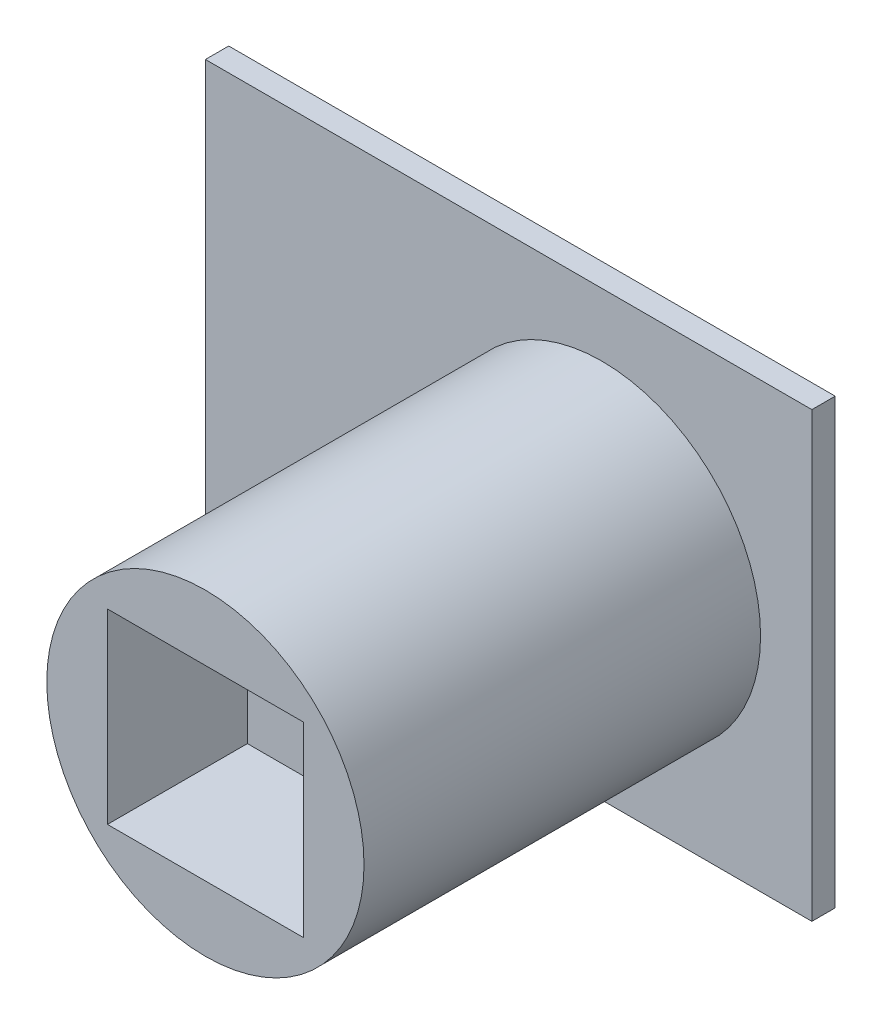
ISO-10303-21;
HEADER;
FILE_DESCRIPTION(('STEP AP214'),'2;1');
FILE_NAME('part.step','',(''),(''),'','','');
FILE_SCHEMA(('AUTOMOTIVE_DESIGN { 1 0 10303 214 1 1 1 1 }'));
ENDSEC;
DATA;
#1=APPLICATION_CONTEXT('core data for automotive mechanical design processes');
#2=APPLICATION_PROTOCOL_DEFINITION('international standard','automotive_design',2000,#1);
#3=PRODUCT_CONTEXT('',#1,'mechanical');
#4=PRODUCT('Part','Part','',(#3));
#5=PRODUCT_RELATED_PRODUCT_CATEGORY('part','',(#4));
#6=PRODUCT_DEFINITION_FORMATION('','',#4);
#7=PRODUCT_DEFINITION_CONTEXT('part definition',#1,'design');
#8=PRODUCT_DEFINITION('design','',#6,#7);
#9=PRODUCT_DEFINITION_SHAPE('','',#8);
#10=(LENGTH_UNIT() NAMED_UNIT(*) SI_UNIT(.MILLI.,.METRE.));
#11=(NAMED_UNIT(*) PLANE_ANGLE_UNIT() SI_UNIT($,.RADIAN.));
#12=(NAMED_UNIT(*) SI_UNIT($,.STERADIAN.) SOLID_ANGLE_UNIT());
#13=UNCERTAINTY_MEASURE_WITH_UNIT(LENGTH_MEASURE(1.E-05),#10,'distance_accuracy_value','');
#14=(GEOMETRIC_REPRESENTATION_CONTEXT(3) GLOBAL_UNCERTAINTY_ASSIGNED_CONTEXT((#13)) GLOBAL_UNIT_ASSIGNED_CONTEXT((#10,
#11,#12)) REPRESENTATION_CONTEXT('',''));
#15=CARTESIAN_POINT('',(0.,0.,0.));
#16=DIRECTION('',(0.,0.,1.));
#17=DIRECTION('',(1.,0.,0.));
#18=AXIS2_PLACEMENT_3D('',#15,#16,#17);
#19=CARTESIAN_POINT('',(65.,-47.5,5.));
#20=DIRECTION('',(-1.,0.,0.));
#21=DIRECTION('',(0.,0.,1.));
#22=AXIS2_PLACEMENT_3D('',#19,#20,#21);
#23=PLANE('',#22);
#24=DIRECTION('',(0.,1.,0.));
#25=VECTOR('',#24,1.);
#26=CARTESIAN_POINT('',(65.,-47.5,0.));
#27=LINE('',#26,#25);
#28=CARTESIAN_POINT('',(65.,-47.5,0.));
#29=VERTEX_POINT('',#28);
#30=CARTESIAN_POINT('',(65.,47.5,0.));
#31=VERTEX_POINT('',#30);
#32=EDGE_CURVE('E172',#29,#31,#27,.T.);
#33=ORIENTED_EDGE('',*,*,#32,.T.);
#34=DIRECTION('',(0.,0.,-1.));
#35=VECTOR('',#34,1.);
#36=CARTESIAN_POINT('',(65.,47.5,5.));
#37=LINE('',#36,#35);
#38=CARTESIAN_POINT('',(65.,47.5,5.));
#39=VERTEX_POINT('',#38);
#40=EDGE_CURVE('E46',#39,#31,#37,.T.);
#41=ORIENTED_EDGE('',*,*,#40,.F.);
#42=DIRECTION('',(0.,1.,0.));
#43=VECTOR('',#42,1.);
#44=CARTESIAN_POINT('',(65.,-47.5,5.));
#45=LINE('',#44,#43);
#46=CARTESIAN_POINT('',(65.,-47.5,5.));
#47=VERTEX_POINT('',#46);
#48=EDGE_CURVE('E174',#47,#39,#45,.T.);
#49=ORIENTED_EDGE('',*,*,#48,.F.);
#50=DIRECTION('',(0.,0.,-1.));
#51=VECTOR('',#50,1.);
#52=CARTESIAN_POINT('',(65.,-47.5,5.));
#53=LINE('',#52,#51);
#54=EDGE_CURVE('E184',#47,#29,#53,.T.);
#55=ORIENTED_EDGE('',*,*,#54,.T.);
#56=EDGE_LOOP('',(#33,#41,#49,#55));
#57=FACE_BOUND('',#56,.T.);
#58=ADVANCED_FACE('F43',(#57),#23,.F.);
#59=CARTESIAN_POINT('',(-65.,47.5,5.));
#60=DIRECTION('',(0.,-1.,0.));
#61=DIRECTION('',(0.,0.,-1.));
#62=AXIS2_PLACEMENT_3D('',#59,#60,#61);
#63=PLANE('',#62);
#64=DIRECTION('',(-1.,0.,0.));
#65=VECTOR('',#64,1.);
#66=CARTESIAN_POINT('',(-65.,47.5,0.));
#67=LINE('',#66,#65);
#68=CARTESIAN_POINT('',(-65.,47.5,0.));
#69=VERTEX_POINT('',#68);
#70=EDGE_CURVE('E188',#31,#69,#67,.T.);
#71=ORIENTED_EDGE('',*,*,#70,.T.);
#72=DIRECTION('',(0.,0.,-1.));
#73=VECTOR('',#72,1.);
#74=CARTESIAN_POINT('',(-65.,47.5,5.));
#75=LINE('',#74,#73);
#76=CARTESIAN_POINT('',(-65.,47.5,5.));
#77=VERTEX_POINT('',#76);
#78=EDGE_CURVE('E200',#77,#69,#75,.T.);
#79=ORIENTED_EDGE('',*,*,#78,.F.);
#80=DIRECTION('',(-1.,0.,0.));
#81=VECTOR('',#80,1.);
#82=CARTESIAN_POINT('',(-65.,47.5,5.));
#83=LINE('',#82,#81);
#84=EDGE_CURVE('E97',#39,#77,#83,.T.);
#85=ORIENTED_EDGE('',*,*,#84,.F.);
#86=ORIENTED_EDGE('',*,*,#40,.T.);
#87=EDGE_LOOP('',(#71,#79,#85,#86));
#88=FACE_BOUND('',#87,.T.);
#89=ADVANCED_FACE('F208',(#88),#63,.F.);
#90=CARTESIAN_POINT('',(-65.,-47.5,5.));
#91=DIRECTION('',(1.,0.,0.));
#92=DIRECTION('',(0.,0.,-1.));
#93=AXIS2_PLACEMENT_3D('',#90,#91,#92);
#94=PLANE('',#93);
#95=DIRECTION('',(0.,-1.,0.));
#96=VECTOR('',#95,1.);
#97=CARTESIAN_POINT('',(-65.,-47.5,0.));
#98=LINE('',#97,#96);
#99=CARTESIAN_POINT('',(-65.,-47.5,0.));
#100=VERTEX_POINT('',#99);
#101=EDGE_CURVE('E191',#69,#100,#98,.T.);
#102=ORIENTED_EDGE('',*,*,#101,.T.);
#103=DIRECTION('',(0.,0.,-1.));
#104=VECTOR('',#103,1.);
#105=CARTESIAN_POINT('',(-65.,-47.5,5.));
#106=LINE('',#105,#104);
#107=CARTESIAN_POINT('',(-65.,-47.5,5.));
#108=VERTEX_POINT('',#107);
#109=EDGE_CURVE('E198',#108,#100,#106,.T.);
#110=ORIENTED_EDGE('',*,*,#109,.F.);
#111=DIRECTION('',(0.,-1.,0.));
#112=VECTOR('',#111,1.);
#113=CARTESIAN_POINT('',(-65.,-47.5,5.));
#114=LINE('',#113,#112);
#115=EDGE_CURVE('E179',#77,#108,#114,.T.);
#116=ORIENTED_EDGE('',*,*,#115,.F.);
#117=ORIENTED_EDGE('',*,*,#78,.T.);
#118=EDGE_LOOP('',(#102,#110,#116,#117));
#119=FACE_BOUND('',#118,.T.);
#120=ADVANCED_FACE('F215',(#119),#94,.F.);
#121=CARTESIAN_POINT('',(-65.,-47.5,5.));
#122=DIRECTION('',(0.,1.,0.));
#123=DIRECTION('',(0.,0.,1.));
#124=AXIS2_PLACEMENT_3D('',#121,#122,#123);
#125=PLANE('',#124);
#126=DIRECTION('',(1.,0.,0.));
#127=VECTOR('',#126,1.);
#128=CARTESIAN_POINT('',(-65.,-47.5,0.));
#129=LINE('',#128,#127);
#130=EDGE_CURVE('E89',#100,#29,#129,.T.);
#131=ORIENTED_EDGE('',*,*,#130,.T.);
#132=ORIENTED_EDGE('',*,*,#54,.F.);
#133=DIRECTION('',(1.,0.,0.));
#134=VECTOR('',#133,1.);
#135=CARTESIAN_POINT('',(-65.,-47.5,5.));
#136=LINE('',#135,#134);
#137=EDGE_CURVE('E68',#108,#47,#136,.T.);
#138=ORIENTED_EDGE('',*,*,#137,.F.);
#139=ORIENTED_EDGE('',*,*,#109,.T.);
#140=EDGE_LOOP('',(#131,#132,#138,#139));
#141=FACE_BOUND('',#140,.T.);
#142=ADVANCED_FACE('F216',(#141),#125,.F.);
#143=CARTESIAN_POINT('',(0.,0.,5.));
#144=DIRECTION('',(0.,0.,-1.));
#145=DIRECTION('',(-1.,0.,0.));
#146=AXIS2_PLACEMENT_3D('',#143,#144,#145);
#147=PLANE('',#146);
#148=CARTESIAN_POINT('',(20.,0.,5.));
#149=DIRECTION('',(0.,0.,1.));
#150=DIRECTION('',(1.,0.,0.));
#151=AXIS2_PLACEMENT_3D('',#148,#149,#150);
#152=CIRCLE('',#151,34.);
#153=CARTESIAN_POINT('',(54.,0.,5.));
#154=VERTEX_POINT('',#153);
#155=EDGE_CURVE('E11',#154,#154,#152,.T.);
#156=ORIENTED_EDGE('',*,*,#155,.F.);
#157=EDGE_LOOP('',(#156));
#158=FACE_BOUND('',#157,.T.);
#159=ORIENTED_EDGE('',*,*,#48,.T.);
#160=ORIENTED_EDGE('',*,*,#84,.T.);
#161=ORIENTED_EDGE('',*,*,#115,.T.);
#162=ORIENTED_EDGE('',*,*,#137,.T.);
#163=EDGE_LOOP('',(#159,#160,#161,#162));
#164=FACE_BOUND('',#163,.T.);
#165=ADVANCED_FACE('F217',(#158,#164),#147,.F.);
#166=CARTESIAN_POINT('',(0.,0.,0.));
#167=DIRECTION('',(0.,0.,-1.));
#168=DIRECTION('',(-1.,0.,0.));
#169=AXIS2_PLACEMENT_3D('',#166,#167,#168);
#170=PLANE('',#169);
#171=ORIENTED_EDGE('',*,*,#32,.F.);
#172=ORIENTED_EDGE('',*,*,#130,.F.);
#173=ORIENTED_EDGE('',*,*,#101,.F.);
#174=ORIENTED_EDGE('',*,*,#70,.F.);
#175=EDGE_LOOP('',(#171,#172,#173,#174));
#176=FACE_BOUND('',#175,.T.);
#177=ADVANCED_FACE('F213',(#176),#170,.T.);
#178=CARTESIAN_POINT('',(20.,0.,90.));
#179=DIRECTION('',(0.,0.,-1.));
#180=DIRECTION('',(-1.,0.,0.));
#181=AXIS2_PLACEMENT_3D('',#178,#179,#180);
#182=CYLINDRICAL_SURFACE('',#181,34.);
#183=CARTESIAN_POINT('',(20.,0.,90.));
#184=DIRECTION('',(0.,0.,1.));
#185=DIRECTION('',(1.,0.,0.));
#186=AXIS2_PLACEMENT_3D('',#183,#184,#185);
#187=CIRCLE('',#186,34.);
#188=CARTESIAN_POINT('',(54.,0.,90.));
#189=VERTEX_POINT('',#188);
#190=EDGE_CURVE('E164',#189,#189,#187,.T.);
#191=ORIENTED_EDGE('',*,*,#190,.F.);
#192=EDGE_LOOP('',(#191));
#193=FACE_BOUND('',#192,.T.);
#194=ORIENTED_EDGE('',*,*,#155,.T.);
#195=EDGE_LOOP('',(#194));
#196=FACE_BOUND('',#195,.T.);
#197=ADVANCED_FACE('F225',(#193,#196),#182,.T.);
#198=CARTESIAN_POINT('',(20.,0.,90.));
#199=DIRECTION('',(0.,0.,1.));
#200=DIRECTION('',(1.,0.,0.));
#201=AXIS2_PLACEMENT_3D('',#198,#199,#200);
#202=PLANE('',#201);
#203=DIRECTION('',(0.,1.,0.));
#204=VECTOR('',#203,1.);
#205=CARTESIAN_POINT('',(41.,-20.,90.));
#206=LINE('',#205,#204);
#207=CARTESIAN_POINT('',(41.,-20.,90.));
#208=VERTEX_POINT('',#207);
#209=CARTESIAN_POINT('',(41.,20.,90.));
#210=VERTEX_POINT('',#209);
#211=EDGE_CURVE('E59',#208,#210,#206,.T.);
#212=ORIENTED_EDGE('',*,*,#211,.F.);
#213=DIRECTION('',(1.,0.,0.));
#214=VECTOR('',#213,1.);
#215=CARTESIAN_POINT('',(-0.999999999999997,-20.,90.));
#216=LINE('',#215,#214);
#217=CARTESIAN_POINT('',(-0.999999999999997,-20.,90.));
#218=VERTEX_POINT('',#217);
#219=EDGE_CURVE('E142',#218,#208,#216,.T.);
#220=ORIENTED_EDGE('',*,*,#219,.F.);
#221=DIRECTION('',(0.,-1.,0.));
#222=VECTOR('',#221,1.);
#223=CARTESIAN_POINT('',(-0.999999999999997,-20.,90.));
#224=LINE('',#223,#222);
#225=CARTESIAN_POINT('',(-0.999999999999997,20.,90.));
#226=VERTEX_POINT('',#225);
#227=EDGE_CURVE('E146',#226,#218,#224,.T.);
#228=ORIENTED_EDGE('',*,*,#227,.F.);
#229=DIRECTION('',(-1.,0.,0.));
#230=VECTOR('',#229,1.);
#231=CARTESIAN_POINT('',(-0.999999999999997,20.,90.));
#232=LINE('',#231,#230);
#233=EDGE_CURVE('E155',#210,#226,#232,.T.);
#234=ORIENTED_EDGE('',*,*,#233,.F.);
#235=EDGE_LOOP('',(#212,#220,#228,#234));
#236=FACE_BOUND('',#235,.T.);
#237=ORIENTED_EDGE('',*,*,#190,.T.);
#238=EDGE_LOOP('',(#237));
#239=FACE_BOUND('',#238,.T.);
#240=ADVANCED_FACE('F266',(#236,#239),#202,.T.);
#241=CARTESIAN_POINT('',(41.,-20.,60.));
#242=DIRECTION('',(1.,0.,0.));
#243=DIRECTION('',(0.,0.,-1.));
#244=AXIS2_PLACEMENT_3D('',#241,#242,#243);
#245=PLANE('',#244);
#246=ORIENTED_EDGE('',*,*,#211,.T.);
#247=DIRECTION('',(0.,0.,1.));
#248=VECTOR('',#247,1.);
#249=CARTESIAN_POINT('',(41.,20.,60.));
#250=LINE('',#249,#248);
#251=CARTESIAN_POINT('',(41.,20.,60.));
#252=VERTEX_POINT('',#251);
#253=EDGE_CURVE('E117',#252,#210,#250,.T.);
#254=ORIENTED_EDGE('',*,*,#253,.F.);
#255=DIRECTION('',(0.,1.,0.));
#256=VECTOR('',#255,1.);
#257=CARTESIAN_POINT('',(41.,-20.,60.));
#258=LINE('',#257,#256);
#259=CARTESIAN_POINT('',(41.,-20.,60.));
#260=VERTEX_POINT('',#259);
#261=EDGE_CURVE('E121',#260,#252,#258,.T.);
#262=ORIENTED_EDGE('',*,*,#261,.F.);
#263=DIRECTION('',(0.,0.,1.));
#264=VECTOR('',#263,1.);
#265=CARTESIAN_POINT('',(41.,-20.,60.));
#266=LINE('',#265,#264);
#267=EDGE_CURVE('E161',#260,#208,#266,.T.);
#268=ORIENTED_EDGE('',*,*,#267,.T.);
#269=EDGE_LOOP('',(#246,#254,#262,#268));
#270=FACE_BOUND('',#269,.T.);
#271=ADVANCED_FACE('F119',(#270),#245,.F.);
#272=CARTESIAN_POINT('',(-0.999999999999997,-20.,60.));
#273=DIRECTION('',(0.,-1.,0.));
#274=DIRECTION('',(0.,0.,-1.));
#275=AXIS2_PLACEMENT_3D('',#272,#273,#274);
#276=PLANE('',#275);
#277=ORIENTED_EDGE('',*,*,#219,.T.);
#278=ORIENTED_EDGE('',*,*,#267,.F.);
#279=DIRECTION('',(1.,0.,0.));
#280=VECTOR('',#279,1.);
#281=CARTESIAN_POINT('',(-0.999999999999997,-20.,60.));
#282=LINE('',#281,#280);
#283=CARTESIAN_POINT('',(-0.999999999999997,-20.,60.));
#284=VERTEX_POINT('',#283);
#285=EDGE_CURVE('E128',#284,#260,#282,.T.);
#286=ORIENTED_EDGE('',*,*,#285,.F.);
#287=DIRECTION('',(0.,0.,1.));
#288=VECTOR('',#287,1.);
#289=CARTESIAN_POINT('',(-0.999999999999997,-20.,60.));
#290=LINE('',#289,#288);
#291=EDGE_CURVE('E165',#284,#218,#290,.T.);
#292=ORIENTED_EDGE('',*,*,#291,.T.);
#293=EDGE_LOOP('',(#277,#278,#286,#292));
#294=FACE_BOUND('',#293,.T.);
#295=ADVANCED_FACE('F286',(#294),#276,.F.);
#296=CARTESIAN_POINT('',(-0.999999999999997,-20.,60.));
#297=DIRECTION('',(-1.,0.,0.));
#298=DIRECTION('',(0.,0.,1.));
#299=AXIS2_PLACEMENT_3D('',#296,#297,#298);
#300=PLANE('',#299);
#301=ORIENTED_EDGE('',*,*,#227,.T.);
#302=ORIENTED_EDGE('',*,*,#291,.F.);
#303=DIRECTION('',(0.,-1.,0.));
#304=VECTOR('',#303,1.);
#305=CARTESIAN_POINT('',(-0.999999999999997,-20.,60.));
#306=LINE('',#305,#304);
#307=CARTESIAN_POINT('',(-0.999999999999997,20.,60.));
#308=VERTEX_POINT('',#307);
#309=EDGE_CURVE('E137',#308,#284,#306,.T.);
#310=ORIENTED_EDGE('',*,*,#309,.F.);
#311=DIRECTION('',(0.,0.,1.));
#312=VECTOR('',#311,1.);
#313=CARTESIAN_POINT('',(-0.999999999999997,20.,60.));
#314=LINE('',#313,#312);
#315=EDGE_CURVE('E127',#308,#226,#314,.T.);
#316=ORIENTED_EDGE('',*,*,#315,.T.);
#317=EDGE_LOOP('',(#301,#302,#310,#316));
#318=FACE_BOUND('',#317,.T.);
#319=ADVANCED_FACE('F296',(#318),#300,.F.);
#320=CARTESIAN_POINT('',(-0.999999999999997,20.,60.));
#321=DIRECTION('',(0.,1.,0.));
#322=DIRECTION('',(0.,0.,1.));
#323=AXIS2_PLACEMENT_3D('',#320,#321,#322);
#324=PLANE('',#323);
#325=ORIENTED_EDGE('',*,*,#233,.T.);
#326=ORIENTED_EDGE('',*,*,#315,.F.);
#327=DIRECTION('',(-1.,0.,0.));
#328=VECTOR('',#327,1.);
#329=CARTESIAN_POINT('',(-0.999999999999997,20.,60.));
#330=LINE('',#329,#328);
#331=EDGE_CURVE('E131',#252,#308,#330,.T.);
#332=ORIENTED_EDGE('',*,*,#331,.F.);
#333=ORIENTED_EDGE('',*,*,#253,.T.);
#334=EDGE_LOOP('',(#325,#326,#332,#333));
#335=FACE_BOUND('',#334,.T.);
#336=ADVANCED_FACE('F132',(#335),#324,.F.);
#337=CARTESIAN_POINT('',(0.,0.,60.));
#338=DIRECTION('',(0.,0.,-1.));
#339=DIRECTION('',(-1.,0.,0.));
#340=AXIS2_PLACEMENT_3D('',#337,#338,#339);
#341=PLANE('',#340);
#342=ORIENTED_EDGE('',*,*,#261,.T.);
#343=ORIENTED_EDGE('',*,*,#331,.T.);
#344=ORIENTED_EDGE('',*,*,#309,.T.);
#345=ORIENTED_EDGE('',*,*,#285,.T.);
#346=EDGE_LOOP('',(#342,#343,#344,#345));
#347=FACE_BOUND('',#346,.T.);
#348=ADVANCED_FACE('F139',(#347),#341,.F.);
#349=CLOSED_SHELL('',(#58,#89,#120,#142,#165,#177,#197,#240,#271,#295,#319,#336,#348));
#350=MANIFOLD_SOLID_BREP('B2',#349);
#351=ADVANCED_BREP_SHAPE_REPRESENTATION('',(#18,#350),#14);
#352=SHAPE_DEFINITION_REPRESENTATION(#9,#351);
ENDSEC;
END-ISO-10303-21;
